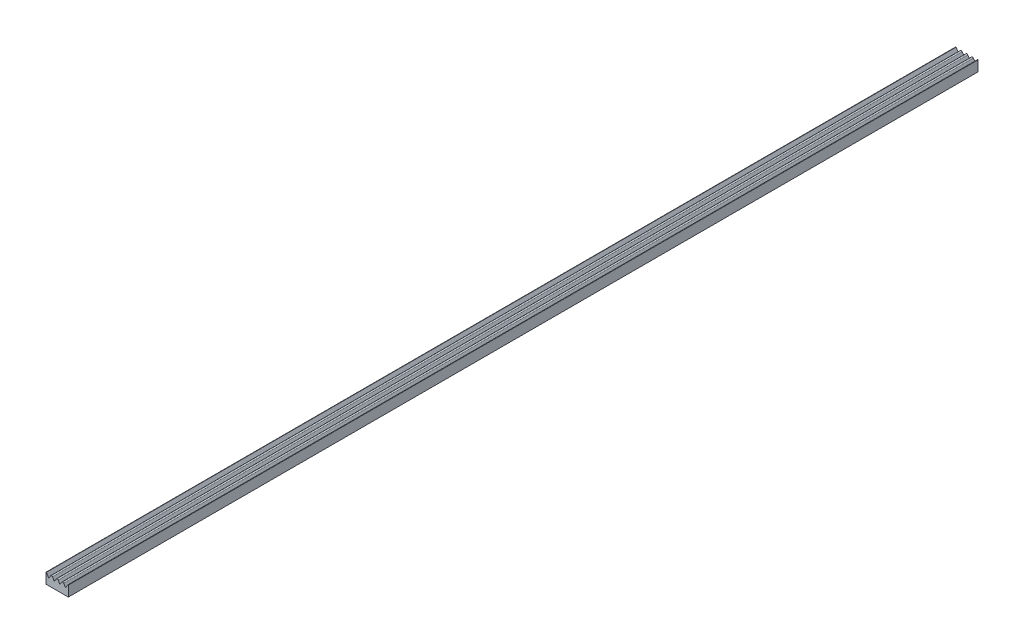
ISO-10303-21;
HEADER;
FILE_DESCRIPTION(('STEP AP214'),'2;1');
FILE_NAME('part.step','',(''),(''),'','','');
FILE_SCHEMA(('AUTOMOTIVE_DESIGN { 1 0 10303 214 1 1 1 1 }'));
ENDSEC;
DATA;
#1=APPLICATION_CONTEXT('core data for automotive mechanical design processes');
#2=APPLICATION_PROTOCOL_DEFINITION('international standard','automotive_design',2000,#1);
#3=PRODUCT_CONTEXT('',#1,'mechanical');
#4=PRODUCT('Part','Part','',(#3));
#5=PRODUCT_RELATED_PRODUCT_CATEGORY('part','',(#4));
#6=PRODUCT_DEFINITION_FORMATION('','',#4);
#7=PRODUCT_DEFINITION_CONTEXT('part definition',#1,'design');
#8=PRODUCT_DEFINITION('design','',#6,#7);
#9=PRODUCT_DEFINITION_SHAPE('','',#8);
#10=(LENGTH_UNIT() NAMED_UNIT(*) SI_UNIT(.MILLI.,.METRE.));
#11=(NAMED_UNIT(*) PLANE_ANGLE_UNIT() SI_UNIT($,.RADIAN.));
#12=(NAMED_UNIT(*) SI_UNIT($,.STERADIAN.) SOLID_ANGLE_UNIT());
#13=UNCERTAINTY_MEASURE_WITH_UNIT(LENGTH_MEASURE(1.E-05),#10,'distance_accuracy_value','');
#14=(GEOMETRIC_REPRESENTATION_CONTEXT(3) GLOBAL_UNCERTAINTY_ASSIGNED_CONTEXT((#13)) GLOBAL_UNIT_ASSIGNED_CONTEXT((#10,
#11,#12)) REPRESENTATION_CONTEXT('',''));
#15=CARTESIAN_POINT('',(0.,0.,0.));
#16=DIRECTION('',(0.,0.,1.));
#17=DIRECTION('',(1.,0.,0.));
#18=AXIS2_PLACEMENT_3D('',#15,#16,#17);
#19=CARTESIAN_POINT('',(0.,0.,517.525));
#20=DIRECTION('',(-1.,0.,0.));
#21=DIRECTION('',(0.,0.,1.));
#22=AXIS2_PLACEMENT_3D('',#19,#20,#21);
#23=PLANE('',#22);
#24=DIRECTION('',(0.,1.,0.));
#25=VECTOR('',#24,1.);
#26=CARTESIAN_POINT('',(0.,0.,0.));
#27=LINE('',#26,#25);
#28=CARTESIAN_POINT('',(0.,0.,0.));
#29=VERTEX_POINT('',#28);
#30=CARTESIAN_POINT('',(0.,5.90717687924576,0.));
#31=VERTEX_POINT('',#30);
#32=EDGE_CURVE('E177',#29,#31,#27,.T.);
#33=ORIENTED_EDGE('',*,*,#32,.T.);
#34=DIRECTION('',(0.,0.,-1.));
#35=VECTOR('',#34,1.);
#36=CARTESIAN_POINT('',(0.,5.90717687924576,517.525));
#37=LINE('',#36,#35);
#38=CARTESIAN_POINT('',(0.,5.90717687924576,517.525));
#39=VERTEX_POINT('',#38);
#40=EDGE_CURVE('E11',#39,#31,#37,.T.);
#41=ORIENTED_EDGE('',*,*,#40,.F.);
#42=DIRECTION('',(0.,1.,0.));
#43=VECTOR('',#42,1.);
#44=CARTESIAN_POINT('',(0.,0.,517.525));
#45=LINE('',#44,#43);
#46=CARTESIAN_POINT('',(0.,0.,517.525));
#47=VERTEX_POINT('',#46);
#48=EDGE_CURVE('E207',#47,#39,#45,.T.);
#49=ORIENTED_EDGE('',*,*,#48,.F.);
#50=DIRECTION('',(0.,0.,-1.));
#51=VECTOR('',#50,1.);
#52=CARTESIAN_POINT('',(0.,0.,517.525));
#53=LINE('',#52,#51);
#54=EDGE_CURVE('E173',#47,#29,#53,.T.);
#55=ORIENTED_EDGE('',*,*,#54,.T.);
#56=EDGE_LOOP('',(#33,#41,#49,#55));
#57=FACE_BOUND('',#56,.T.);
#58=ADVANCED_FACE('F33',(#57),#23,.F.);
#59=CARTESIAN_POINT('',(-0.127,5.90717687924576,517.525));
#60=DIRECTION('',(0.,0.,-1.));
#61=DIRECTION('',(-1.,0.,0.));
#62=AXIS2_PLACEMENT_3D('',#59,#60,#61);
#63=CYLINDRICAL_SURFACE('',#62,0.127);
#64=CARTESIAN_POINT('',(-0.127,5.90717687924576,0.));
#65=DIRECTION('',(0.,0.,1.));
#66=DIRECTION('',(1.,0.,0.));
#67=AXIS2_PLACEMENT_3D('',#64,#65,#66);
#68=CIRCLE('',#67,0.127);
#69=CARTESIAN_POINT('',(-0.234695784608649,5.97448674462616,0.));
#70=VERTEX_POINT('',#69);
#71=EDGE_CURVE('E180',#31,#70,#68,.T.);
#72=ORIENTED_EDGE('',*,*,#71,.T.);
#73=DIRECTION('',(0.,0.,-1.));
#74=VECTOR('',#73,1.);
#75=CARTESIAN_POINT('',(-0.234695784608649,5.97448674462616,517.525));
#76=LINE('',#75,#74);
#77=CARTESIAN_POINT('',(-0.234695784608649,5.97448674462616,517.525));
#78=VERTEX_POINT('',#77);
#79=EDGE_CURVE('E41',#78,#70,#76,.T.);
#80=ORIENTED_EDGE('',*,*,#79,.F.);
#81=CARTESIAN_POINT('',(-0.127,5.90717687924576,517.525));
#82=DIRECTION('',(0.,0.,1.));
#83=DIRECTION('',(1.,0.,0.));
#84=AXIS2_PLACEMENT_3D('',#81,#82,#83);
#85=CIRCLE('',#84,0.127);
#86=EDGE_CURVE('E116',#39,#78,#85,.T.);
#87=ORIENTED_EDGE('',*,*,#86,.F.);
#88=ORIENTED_EDGE('',*,*,#40,.T.);
#89=EDGE_LOOP('',(#72,#80,#87,#88));
#90=FACE_BOUND('',#89,.T.);
#91=ADVANCED_FACE('F305',(#90),#63,.T.);
#92=CARTESIAN_POINT('',(-1.5875,3.81,517.525));
#93=DIRECTION('',(0.847998304005088,-0.529998940003179,0.));
#94=DIRECTION('',(0.529998940003179,0.847998304005088,0.));
#95=AXIS2_PLACEMENT_3D('',#92,#93,#94);
#96=PLANE('',#95);
#97=DIRECTION('',(-0.529998940003179,-0.847998304005088,0.));
#98=VECTOR('',#97,1.);
#99=CARTESIAN_POINT('',(-1.5875,3.81,0.));
#100=LINE('',#99,#98);
#101=CARTESIAN_POINT('',(-1.5875,3.81,0.));
#102=VERTEX_POINT('',#101);
#103=EDGE_CURVE('E182',#70,#102,#100,.T.);
#104=ORIENTED_EDGE('',*,*,#103,.T.);
#105=DIRECTION('',(0.,0.,-1.));
#106=VECTOR('',#105,1.);
#107=CARTESIAN_POINT('',(-1.5875,3.81,517.525));
#108=LINE('',#107,#106);
#109=CARTESIAN_POINT('',(-1.5875,3.81,517.525));
#110=VERTEX_POINT('',#109);
#111=EDGE_CURVE('E238',#110,#102,#108,.T.);
#112=ORIENTED_EDGE('',*,*,#111,.F.);
#113=DIRECTION('',(-0.529998940003179,-0.847998304005088,0.));
#114=VECTOR('',#113,1.);
#115=CARTESIAN_POINT('',(-1.5875,3.81,517.525));
#116=LINE('',#115,#114);
#117=EDGE_CURVE('E246',#78,#110,#116,.T.);
#118=ORIENTED_EDGE('',*,*,#117,.F.);
#119=ORIENTED_EDGE('',*,*,#79,.T.);
#120=EDGE_LOOP('',(#104,#112,#118,#119));
#121=FACE_BOUND('',#120,.T.);
#122=ADVANCED_FACE('F244',(#121),#96,.F.);
#123=CARTESIAN_POINT('',(-2.63652107695677,5.48843372313082,517.525));
#124=DIRECTION('',(-0.847998304005088,-0.52999894000318,0.));
#125=DIRECTION('',(0.52999894000318,-0.847998304005088,0.));
#126=AXIS2_PLACEMENT_3D('',#123,#124,#125);
#127=PLANE('',#126);
#128=DIRECTION('',(-0.52999894000318,0.847998304005088,0.));
#129=VECTOR('',#128,1.);
#130=CARTESIAN_POINT('',(-2.63652107695677,5.48843372313082,0.));
#131=LINE('',#130,#129);
#132=CARTESIAN_POINT('',(-2.63652107695677,5.48843372313082,0.));
#133=VERTEX_POINT('',#132);
#134=EDGE_CURVE('E184',#102,#133,#131,.T.);
#135=ORIENTED_EDGE('',*,*,#134,.T.);
#136=DIRECTION('',(0.,0.,-1.));
#137=VECTOR('',#136,1.);
#138=CARTESIAN_POINT('',(-2.63652107695677,5.48843372313082,517.525));
#139=LINE('',#138,#137);
#140=CARTESIAN_POINT('',(-2.63652107695677,5.48843372313082,517.525));
#141=VERTEX_POINT('',#140);
#142=EDGE_CURVE('E235',#141,#133,#139,.T.);
#143=ORIENTED_EDGE('',*,*,#142,.F.);
#144=DIRECTION('',(-0.52999894000318,0.847998304005088,0.));
#145=VECTOR('',#144,1.);
#146=CARTESIAN_POINT('',(-2.63652107695677,5.48843372313082,517.525));
#147=LINE('',#146,#145);
#148=EDGE_CURVE('E264',#110,#141,#147,.T.);
#149=ORIENTED_EDGE('',*,*,#148,.F.);
#150=ORIENTED_EDGE('',*,*,#111,.T.);
#151=EDGE_LOOP('',(#135,#143,#149,#150));
#152=FACE_BOUND('',#151,.T.);
#153=ADVANCED_FACE('F255',(#152),#127,.F.);
#154=CARTESIAN_POINT('',(-3.175,5.15188439622881,517.525));
#155=DIRECTION('',(0.,0.,-1.));
#156=DIRECTION('',(-1.,0.,0.));
#157=AXIS2_PLACEMENT_3D('',#154,#155,#156);
#158=CYLINDRICAL_SURFACE('',#157,0.635);
#159=CARTESIAN_POINT('',(-3.175,5.15188439622881,0.));
#160=DIRECTION('',(0.,0.,1.));
#161=DIRECTION('',(-1.,0.,0.));
#162=AXIS2_PLACEMENT_3D('',#159,#160,#161);
#163=CIRCLE('',#162,0.635);
#164=CARTESIAN_POINT('',(-3.71347892304324,5.48843372313082,0.));
#165=VERTEX_POINT('',#164);
#166=EDGE_CURVE('E186',#133,#165,#163,.T.);
#167=ORIENTED_EDGE('',*,*,#166,.T.);
#168=DIRECTION('',(0.,0.,-1.));
#169=VECTOR('',#168,1.);
#170=CARTESIAN_POINT('',(-3.71347892304324,5.48843372313082,517.525));
#171=LINE('',#170,#169);
#172=CARTESIAN_POINT('',(-3.71347892304324,5.48843372313082,517.525));
#173=VERTEX_POINT('',#172);
#174=EDGE_CURVE('E232',#173,#165,#171,.T.);
#175=ORIENTED_EDGE('',*,*,#174,.F.);
#176=CARTESIAN_POINT('',(-3.175,5.15188439622881,517.525));
#177=DIRECTION('',(0.,0.,1.));
#178=DIRECTION('',(-1.,0.,0.));
#179=AXIS2_PLACEMENT_3D('',#176,#177,#178);
#180=CIRCLE('',#179,0.635);
#181=EDGE_CURVE('E261',#141,#173,#180,.T.);
#182=ORIENTED_EDGE('',*,*,#181,.F.);
#183=ORIENTED_EDGE('',*,*,#142,.T.);
#184=EDGE_LOOP('',(#167,#175,#182,#183));
#185=FACE_BOUND('',#184,.T.);
#186=ADVANCED_FACE('F259',(#185),#158,.T.);
#187=CARTESIAN_POINT('',(-4.7625,3.81,517.525));
#188=DIRECTION('',(0.847998304005088,-0.52999894000318,0.));
#189=DIRECTION('',(0.52999894000318,0.847998304005088,0.));
#190=AXIS2_PLACEMENT_3D('',#187,#188,#189);
#191=PLANE('',#190);
#192=DIRECTION('',(-0.52999894000318,-0.847998304005088,0.));
#193=VECTOR('',#192,1.);
#194=CARTESIAN_POINT('',(-4.7625,3.81,0.));
#195=LINE('',#194,#193);
#196=CARTESIAN_POINT('',(-4.7625,3.81,0.));
#197=VERTEX_POINT('',#196);
#198=EDGE_CURVE('E188',#165,#197,#195,.T.);
#199=ORIENTED_EDGE('',*,*,#198,.T.);
#200=DIRECTION('',(0.,0.,-1.));
#201=VECTOR('',#200,1.);
#202=CARTESIAN_POINT('',(-4.7625,3.81,517.525));
#203=LINE('',#202,#201);
#204=CARTESIAN_POINT('',(-4.7625,3.81,517.525));
#205=VERTEX_POINT('',#204);
#206=EDGE_CURVE('E229',#205,#197,#203,.T.);
#207=ORIENTED_EDGE('',*,*,#206,.F.);
#208=DIRECTION('',(-0.52999894000318,-0.847998304005088,0.));
#209=VECTOR('',#208,1.);
#210=CARTESIAN_POINT('',(-4.7625,3.81,517.525));
#211=LINE('',#210,#209);
#212=EDGE_CURVE('E263',#173,#205,#211,.T.);
#213=ORIENTED_EDGE('',*,*,#212,.F.);
#214=ORIENTED_EDGE('',*,*,#174,.T.);
#215=EDGE_LOOP('',(#199,#207,#213,#214));
#216=FACE_BOUND('',#215,.T.);
#217=ADVANCED_FACE('F318',(#216),#191,.F.);
#218=CARTESIAN_POINT('',(-4.7625,3.81,517.525));
#219=DIRECTION('',(-0.847998304005088,-0.52999894000318,0.));
#220=DIRECTION('',(0.52999894000318,-0.847998304005088,0.));
#221=AXIS2_PLACEMENT_3D('',#218,#219,#220);
#222=PLANE('',#221);
#223=DIRECTION('',(-0.52999894000318,0.847998304005088,0.));
#224=VECTOR('',#223,1.);
#225=CARTESIAN_POINT('',(-4.7625,3.81,0.));
#226=LINE('',#225,#224);
#227=CARTESIAN_POINT('',(-5.81152107695676,5.48843372313082,0.));
#228=VERTEX_POINT('',#227);
#229=EDGE_CURVE('E190',#197,#228,#226,.T.);
#230=ORIENTED_EDGE('',*,*,#229,.T.);
#231=DIRECTION('',(0.,0.,-1.));
#232=VECTOR('',#231,1.);
#233=CARTESIAN_POINT('',(-5.81152107695676,5.48843372313082,517.525));
#234=LINE('',#233,#232);
#235=CARTESIAN_POINT('',(-5.81152107695676,5.48843372313082,517.525));
#236=VERTEX_POINT('',#235);
#237=EDGE_CURVE('E226',#236,#228,#234,.T.);
#238=ORIENTED_EDGE('',*,*,#237,.F.);
#239=DIRECTION('',(-0.52999894000318,0.847998304005088,0.));
#240=VECTOR('',#239,1.);
#241=CARTESIAN_POINT('',(-4.7625,3.81,517.525));
#242=LINE('',#241,#240);
#243=EDGE_CURVE('E266',#205,#236,#242,.T.);
#244=ORIENTED_EDGE('',*,*,#243,.F.);
#245=ORIENTED_EDGE('',*,*,#206,.T.);
#246=EDGE_LOOP('',(#230,#238,#244,#245));
#247=FACE_BOUND('',#246,.T.);
#248=ADVANCED_FACE('F321',(#247),#222,.F.);
#249=CARTESIAN_POINT('',(-6.35,5.15188439622881,517.525));
#250=DIRECTION('',(0.,0.,-1.));
#251=DIRECTION('',(-1.,0.,0.));
#252=AXIS2_PLACEMENT_3D('',#249,#250,#251);
#253=CYLINDRICAL_SURFACE('',#252,0.635);
#254=CARTESIAN_POINT('',(-6.35,5.15188439622881,0.));
#255=DIRECTION('',(0.,0.,1.));
#256=DIRECTION('',(-1.,0.,0.));
#257=AXIS2_PLACEMENT_3D('',#254,#255,#256);
#258=CIRCLE('',#257,0.635);
#259=CARTESIAN_POINT('',(-6.88847892304323,5.48843372313082,0.));
#260=VERTEX_POINT('',#259);
#261=EDGE_CURVE('E192',#228,#260,#258,.T.);
#262=ORIENTED_EDGE('',*,*,#261,.T.);
#263=DIRECTION('',(0.,0.,-1.));
#264=VECTOR('',#263,1.);
#265=CARTESIAN_POINT('',(-6.88847892304323,5.48843372313082,517.525));
#266=LINE('',#265,#264);
#267=CARTESIAN_POINT('',(-6.88847892304323,5.48843372313082,517.525));
#268=VERTEX_POINT('',#267);
#269=EDGE_CURVE('E223',#268,#260,#266,.T.);
#270=ORIENTED_EDGE('',*,*,#269,.F.);
#271=CARTESIAN_POINT('',(-6.35,5.15188439622881,517.525));
#272=DIRECTION('',(0.,0.,1.));
#273=DIRECTION('',(-1.,0.,0.));
#274=AXIS2_PLACEMENT_3D('',#271,#272,#273);
#275=CIRCLE('',#274,0.635);
#276=EDGE_CURVE('E272',#236,#268,#275,.T.);
#277=ORIENTED_EDGE('',*,*,#276,.F.);
#278=ORIENTED_EDGE('',*,*,#237,.T.);
#279=EDGE_LOOP('',(#262,#270,#277,#278));
#280=FACE_BOUND('',#279,.T.);
#281=ADVANCED_FACE('F325',(#280),#253,.T.);
#282=CARTESIAN_POINT('',(-7.9375,3.81,517.525));
#283=DIRECTION('',(0.847998304005088,-0.52999894000318,0.));
#284=DIRECTION('',(0.52999894000318,0.847998304005088,0.));
#285=AXIS2_PLACEMENT_3D('',#282,#283,#284);
#286=PLANE('',#285);
#287=DIRECTION('',(-0.52999894000318,-0.847998304005088,0.));
#288=VECTOR('',#287,1.);
#289=CARTESIAN_POINT('',(-7.9375,3.81,0.));
#290=LINE('',#289,#288);
#291=CARTESIAN_POINT('',(-7.9375,3.81,0.));
#292=VERTEX_POINT('',#291);
#293=EDGE_CURVE('E194',#260,#292,#290,.T.);
#294=ORIENTED_EDGE('',*,*,#293,.T.);
#295=DIRECTION('',(0.,0.,-1.));
#296=VECTOR('',#295,1.);
#297=CARTESIAN_POINT('',(-7.9375,3.81,517.525));
#298=LINE('',#297,#296);
#299=CARTESIAN_POINT('',(-7.9375,3.81,517.525));
#300=VERTEX_POINT('',#299);
#301=EDGE_CURVE('E220',#300,#292,#298,.T.);
#302=ORIENTED_EDGE('',*,*,#301,.F.);
#303=DIRECTION('',(-0.52999894000318,-0.847998304005088,0.));
#304=VECTOR('',#303,1.);
#305=CARTESIAN_POINT('',(-7.9375,3.81,517.525));
#306=LINE('',#305,#304);
#307=EDGE_CURVE('E274',#268,#300,#306,.T.);
#308=ORIENTED_EDGE('',*,*,#307,.F.);
#309=ORIENTED_EDGE('',*,*,#269,.T.);
#310=EDGE_LOOP('',(#294,#302,#308,#309));
#311=FACE_BOUND('',#310,.T.);
#312=ADVANCED_FACE('F329',(#311),#286,.F.);
#313=CARTESIAN_POINT('',(-7.9375,3.81,517.525));
#314=DIRECTION('',(-0.847998304005088,-0.52999894000318,0.));
#315=DIRECTION('',(0.52999894000318,-0.847998304005088,0.));
#316=AXIS2_PLACEMENT_3D('',#313,#314,#315);
#317=PLANE('',#316);
#318=DIRECTION('',(-0.52999894000318,0.847998304005088,0.));
#319=VECTOR('',#318,1.);
#320=CARTESIAN_POINT('',(-7.9375,3.81,0.));
#321=LINE('',#320,#319);
#322=CARTESIAN_POINT('',(-8.98652107695676,5.48843372313082,0.));
#323=VERTEX_POINT('',#322);
#324=EDGE_CURVE('E196',#292,#323,#321,.T.);
#325=ORIENTED_EDGE('',*,*,#324,.T.);
#326=DIRECTION('',(0.,0.,-1.));
#327=VECTOR('',#326,1.);
#328=CARTESIAN_POINT('',(-8.98652107695676,5.48843372313082,517.525));
#329=LINE('',#328,#327);
#330=CARTESIAN_POINT('',(-8.98652107695676,5.48843372313082,517.525));
#331=VERTEX_POINT('',#330);
#332=EDGE_CURVE('E217',#331,#323,#329,.T.);
#333=ORIENTED_EDGE('',*,*,#332,.F.);
#334=DIRECTION('',(-0.52999894000318,0.847998304005088,0.));
#335=VECTOR('',#334,1.);
#336=CARTESIAN_POINT('',(-7.9375,3.81,517.525));
#337=LINE('',#336,#335);
#338=EDGE_CURVE('E276',#300,#331,#337,.T.);
#339=ORIENTED_EDGE('',*,*,#338,.F.);
#340=ORIENTED_EDGE('',*,*,#301,.T.);
#341=EDGE_LOOP('',(#325,#333,#339,#340));
#342=FACE_BOUND('',#341,.T.);
#343=ADVANCED_FACE('F333',(#342),#317,.F.);
#344=CARTESIAN_POINT('',(-9.525,5.15188439622881,517.525));
#345=DIRECTION('',(0.,0.,-1.));
#346=DIRECTION('',(-1.,0.,0.));
#347=AXIS2_PLACEMENT_3D('',#344,#345,#346);
#348=CYLINDRICAL_SURFACE('',#347,0.635);
#349=CARTESIAN_POINT('',(-9.525,5.15188439622881,0.));
#350=DIRECTION('',(0.,0.,1.));
#351=DIRECTION('',(1.,0.,0.));
#352=AXIS2_PLACEMENT_3D('',#349,#350,#351);
#353=CIRCLE('',#352,0.635);
#354=CARTESIAN_POINT('',(-10.0634789230432,5.48843372313082,0.));
#355=VERTEX_POINT('',#354);
#356=EDGE_CURVE('E198',#323,#355,#353,.T.);
#357=ORIENTED_EDGE('',*,*,#356,.T.);
#358=DIRECTION('',(0.,0.,-1.));
#359=VECTOR('',#358,1.);
#360=CARTESIAN_POINT('',(-10.0634789230432,5.48843372313082,517.525));
#361=LINE('',#360,#359);
#362=CARTESIAN_POINT('',(-10.0634789230432,5.48843372313082,517.525));
#363=VERTEX_POINT('',#362);
#364=EDGE_CURVE('E214',#363,#355,#361,.T.);
#365=ORIENTED_EDGE('',*,*,#364,.F.);
#366=CARTESIAN_POINT('',(-9.525,5.15188439622881,517.525));
#367=DIRECTION('',(0.,0.,1.));
#368=DIRECTION('',(1.,0.,0.));
#369=AXIS2_PLACEMENT_3D('',#366,#367,#368);
#370=CIRCLE('',#369,0.635);
#371=EDGE_CURVE('E278',#331,#363,#370,.T.);
#372=ORIENTED_EDGE('',*,*,#371,.F.);
#373=ORIENTED_EDGE('',*,*,#332,.T.);
#374=EDGE_LOOP('',(#357,#365,#372,#373));
#375=FACE_BOUND('',#374,.T.);
#376=ADVANCED_FACE('F337',(#375),#348,.T.);
#377=CARTESIAN_POINT('',(-10.0634789230432,5.48843372313082,517.525));
#378=DIRECTION('',(0.847998304005088,-0.52999894000318,0.));
#379=DIRECTION('',(0.52999894000318,0.847998304005088,0.));
#380=AXIS2_PLACEMENT_3D('',#377,#378,#379);
#381=PLANE('',#380);
#382=DIRECTION('',(-0.52999894000318,-0.847998304005088,0.));
#383=VECTOR('',#382,1.);
#384=CARTESIAN_POINT('',(-10.0634789230432,5.48843372313082,0.));
#385=LINE('',#384,#383);
#386=CARTESIAN_POINT('',(-11.1125,3.81,0.));
#387=VERTEX_POINT('',#386);
#388=EDGE_CURVE('E200',#355,#387,#385,.T.);
#389=ORIENTED_EDGE('',*,*,#388,.T.);
#390=DIRECTION('',(0.,0.,-1.));
#391=VECTOR('',#390,1.);
#392=CARTESIAN_POINT('',(-11.1125,3.81,517.525));
#393=LINE('',#392,#391);
#394=CARTESIAN_POINT('',(-11.1125,3.81,517.525));
#395=VERTEX_POINT('',#394);
#396=EDGE_CURVE('E211',#395,#387,#393,.T.);
#397=ORIENTED_EDGE('',*,*,#396,.F.);
#398=DIRECTION('',(-0.52999894000318,-0.847998304005088,0.));
#399=VECTOR('',#398,1.);
#400=CARTESIAN_POINT('',(-10.0634789230432,5.48843372313082,517.525));
#401=LINE('',#400,#399);
#402=EDGE_CURVE('E280',#363,#395,#401,.T.);
#403=ORIENTED_EDGE('',*,*,#402,.F.);
#404=ORIENTED_EDGE('',*,*,#364,.T.);
#405=EDGE_LOOP('',(#389,#397,#403,#404));
#406=FACE_BOUND('',#405,.T.);
#407=ADVANCED_FACE('F286',(#406),#381,.F.);
#408=CARTESIAN_POINT('',(-11.1125,3.81,517.525));
#409=DIRECTION('',(-0.847998304005088,-0.52999894000318,0.));
#410=DIRECTION('',(0.52999894000318,-0.847998304005088,0.));
#411=AXIS2_PLACEMENT_3D('',#408,#409,#410);
#412=PLANE('',#411);
#413=DIRECTION('',(-0.52999894000318,0.847998304005088,0.));
#414=VECTOR('',#413,1.);
#415=CARTESIAN_POINT('',(-11.1125,3.81,0.));
#416=LINE('',#415,#414);
#417=CARTESIAN_POINT('',(-12.4653042153914,5.97448674462616,0.));
#418=VERTEX_POINT('',#417);
#419=EDGE_CURVE('E202',#387,#418,#416,.T.);
#420=ORIENTED_EDGE('',*,*,#419,.T.);
#421=DIRECTION('',(0.,0.,-1.));
#422=VECTOR('',#421,1.);
#423=CARTESIAN_POINT('',(-12.4653042153914,5.97448674462616,517.525));
#424=LINE('',#423,#422);
#425=CARTESIAN_POINT('',(-12.4653042153914,5.97448674462616,517.525));
#426=VERTEX_POINT('',#425);
#427=EDGE_CURVE('E168',#426,#418,#424,.T.);
#428=ORIENTED_EDGE('',*,*,#427,.F.);
#429=DIRECTION('',(-0.52999894000318,0.847998304005088,0.));
#430=VECTOR('',#429,1.);
#431=CARTESIAN_POINT('',(-11.1125,3.81,517.525));
#432=LINE('',#431,#430);
#433=EDGE_CURVE('E159',#395,#426,#432,.T.);
#434=ORIENTED_EDGE('',*,*,#433,.F.);
#435=ORIENTED_EDGE('',*,*,#396,.T.);
#436=EDGE_LOOP('',(#420,#428,#434,#435));
#437=FACE_BOUND('',#436,.T.);
#438=ADVANCED_FACE('F290',(#437),#412,.F.);
#439=CARTESIAN_POINT('',(-12.573,5.90717687924576,517.525));
#440=DIRECTION('',(0.,0.,-1.));
#441=DIRECTION('',(-1.,0.,0.));
#442=AXIS2_PLACEMENT_3D('',#439,#440,#441);
#443=CYLINDRICAL_SURFACE('',#442,0.127);
#444=CARTESIAN_POINT('',(-12.573,5.90717687924576,0.));
#445=DIRECTION('',(0.,0.,1.));
#446=DIRECTION('',(1.,0.,0.));
#447=AXIS2_PLACEMENT_3D('',#444,#445,#446);
#448=CIRCLE('',#447,0.127);
#449=CARTESIAN_POINT('',(-12.7,5.90717687924575,0.));
#450=VERTEX_POINT('',#449);
#451=EDGE_CURVE('E167',#418,#450,#448,.T.);
#452=ORIENTED_EDGE('',*,*,#451,.T.);
#453=DIRECTION('',(0.,0.,-1.));
#454=VECTOR('',#453,1.);
#455=CARTESIAN_POINT('',(-12.7,5.90717687924575,517.525));
#456=LINE('',#455,#454);
#457=CARTESIAN_POINT('',(-12.7,5.90717687924575,517.525));
#458=VERTEX_POINT('',#457);
#459=EDGE_CURVE('E164',#458,#450,#456,.T.);
#460=ORIENTED_EDGE('',*,*,#459,.F.);
#461=CARTESIAN_POINT('',(-12.573,5.90717687924576,517.525));
#462=DIRECTION('',(0.,0.,1.));
#463=DIRECTION('',(1.,0.,0.));
#464=AXIS2_PLACEMENT_3D('',#461,#462,#463);
#465=CIRCLE('',#464,0.127);
#466=EDGE_CURVE('E153',#426,#458,#465,.T.);
#467=ORIENTED_EDGE('',*,*,#466,.F.);
#468=ORIENTED_EDGE('',*,*,#427,.T.);
#469=EDGE_LOOP('',(#452,#460,#467,#468));
#470=FACE_BOUND('',#469,.T.);
#471=ADVANCED_FACE('F165',(#470),#443,.T.);
#472=CARTESIAN_POINT('',(-12.7,0.,517.525));
#473=DIRECTION('',(1.,0.,0.));
#474=DIRECTION('',(0.,0.,-1.));
#475=AXIS2_PLACEMENT_3D('',#472,#473,#474);
#476=PLANE('',#475);
#477=DIRECTION('',(0.,-1.,0.));
#478=VECTOR('',#477,1.);
#479=CARTESIAN_POINT('',(-12.7,0.,0.));
#480=LINE('',#479,#478);
#481=CARTESIAN_POINT('',(-12.7,0.,0.));
#482=VERTEX_POINT('',#481);
#483=EDGE_CURVE('E102',#450,#482,#480,.T.);
#484=ORIENTED_EDGE('',*,*,#483,.T.);
#485=DIRECTION('',(0.,0.,-1.));
#486=VECTOR('',#485,1.);
#487=CARTESIAN_POINT('',(-12.7,0.,517.525));
#488=LINE('',#487,#486);
#489=CARTESIAN_POINT('',(-12.7,0.,517.525));
#490=VERTEX_POINT('',#489);
#491=EDGE_CURVE('E169',#490,#482,#488,.T.);
#492=ORIENTED_EDGE('',*,*,#491,.F.);
#493=DIRECTION('',(0.,-1.,0.));
#494=VECTOR('',#493,1.);
#495=CARTESIAN_POINT('',(-12.7,0.,517.525));
#496=LINE('',#495,#494);
#497=EDGE_CURVE('E157',#458,#490,#496,.T.);
#498=ORIENTED_EDGE('',*,*,#497,.F.);
#499=ORIENTED_EDGE('',*,*,#459,.T.);
#500=EDGE_LOOP('',(#484,#492,#498,#499));
#501=FACE_BOUND('',#500,.T.);
#502=ADVANCED_FACE('F171',(#501),#476,.F.);
#503=CARTESIAN_POINT('',(0.,0.,517.525));
#504=DIRECTION('',(0.,1.,0.));
#505=DIRECTION('',(-1.,0.,0.));
#506=AXIS2_PLACEMENT_3D('',#503,#504,#505);
#507=PLANE('',#506);
#508=DIRECTION('',(1.,0.,0.));
#509=VECTOR('',#508,1.);
#510=CARTESIAN_POINT('',(0.,0.,0.));
#511=LINE('',#510,#509);
#512=EDGE_CURVE('E108',#482,#29,#511,.T.);
#513=ORIENTED_EDGE('',*,*,#512,.T.);
#514=ORIENTED_EDGE('',*,*,#54,.F.);
#515=DIRECTION('',(1.,0.,0.));
#516=VECTOR('',#515,1.);
#517=CARTESIAN_POINT('',(0.,0.,517.525));
#518=LINE('',#517,#516);
#519=EDGE_CURVE('E49',#490,#47,#518,.T.);
#520=ORIENTED_EDGE('',*,*,#519,.F.);
#521=ORIENTED_EDGE('',*,*,#491,.T.);
#522=EDGE_LOOP('',(#513,#514,#520,#521));
#523=FACE_BOUND('',#522,.T.);
#524=ADVANCED_FACE('F294',(#523),#507,.F.);
#525=CARTESIAN_POINT('',(-0.127,5.90717687924576,517.525));
#526=DIRECTION('',(0.,0.,1.));
#527=DIRECTION('',(1.,0.,0.));
#528=AXIS2_PLACEMENT_3D('',#525,#526,#527);
#529=PLANE('',#528);
#530=ORIENTED_EDGE('',*,*,#48,.T.);
#531=ORIENTED_EDGE('',*,*,#86,.T.);
#532=ORIENTED_EDGE('',*,*,#117,.T.);
#533=ORIENTED_EDGE('',*,*,#148,.T.);
#534=ORIENTED_EDGE('',*,*,#181,.T.);
#535=ORIENTED_EDGE('',*,*,#212,.T.);
#536=ORIENTED_EDGE('',*,*,#243,.T.);
#537=ORIENTED_EDGE('',*,*,#276,.T.);
#538=ORIENTED_EDGE('',*,*,#307,.T.);
#539=ORIENTED_EDGE('',*,*,#338,.T.);
#540=ORIENTED_EDGE('',*,*,#371,.T.);
#541=ORIENTED_EDGE('',*,*,#402,.T.);
#542=ORIENTED_EDGE('',*,*,#433,.T.);
#543=ORIENTED_EDGE('',*,*,#466,.T.);
#544=ORIENTED_EDGE('',*,*,#497,.T.);
#545=ORIENTED_EDGE('',*,*,#519,.T.);
#546=EDGE_LOOP('',(#530,#531,#532,#533,#534,#535,#536,#537,#538,#539,#540,#541,#542,#543,#544,#545));
#547=FACE_BOUND('',#546,.T.);
#548=ADVANCED_FACE('F155',(#547),#529,.T.);
#549=CARTESIAN_POINT('',(-0.127,5.90717687924576,0.));
#550=DIRECTION('',(0.,0.,1.));
#551=DIRECTION('',(1.,0.,0.));
#552=AXIS2_PLACEMENT_3D('',#549,#550,#551);
#553=PLANE('',#552);
#554=ORIENTED_EDGE('',*,*,#32,.F.);
#555=ORIENTED_EDGE('',*,*,#512,.F.);
#556=ORIENTED_EDGE('',*,*,#483,.F.);
#557=ORIENTED_EDGE('',*,*,#451,.F.);
#558=ORIENTED_EDGE('',*,*,#419,.F.);
#559=ORIENTED_EDGE('',*,*,#388,.F.);
#560=ORIENTED_EDGE('',*,*,#356,.F.);
#561=ORIENTED_EDGE('',*,*,#324,.F.);
#562=ORIENTED_EDGE('',*,*,#293,.F.);
#563=ORIENTED_EDGE('',*,*,#261,.F.);
#564=ORIENTED_EDGE('',*,*,#229,.F.);
#565=ORIENTED_EDGE('',*,*,#198,.F.);
#566=ORIENTED_EDGE('',*,*,#166,.F.);
#567=ORIENTED_EDGE('',*,*,#134,.F.);
#568=ORIENTED_EDGE('',*,*,#103,.F.);
#569=ORIENTED_EDGE('',*,*,#71,.F.);
#570=EDGE_LOOP('',(#554,#555,#556,#557,#558,#559,#560,#561,#562,#563,#564,#565,#566,#567,#568,#569));
#571=FACE_BOUND('',#570,.T.);
#572=ADVANCED_FACE('F250',(#571),#553,.F.);
#573=CLOSED_SHELL('',(#58,#91,#122,#153,#186,#217,#248,#281,#312,#343,#376,#407,#438,#471,#502,
#524,#548,#572));
#574=MANIFOLD_SOLID_BREP('B2',#573);
#575=ADVANCED_BREP_SHAPE_REPRESENTATION('',(#18,#574),#14);
#576=SHAPE_DEFINITION_REPRESENTATION(#9,#575);
ENDSEC;
END-ISO-10303-21;
